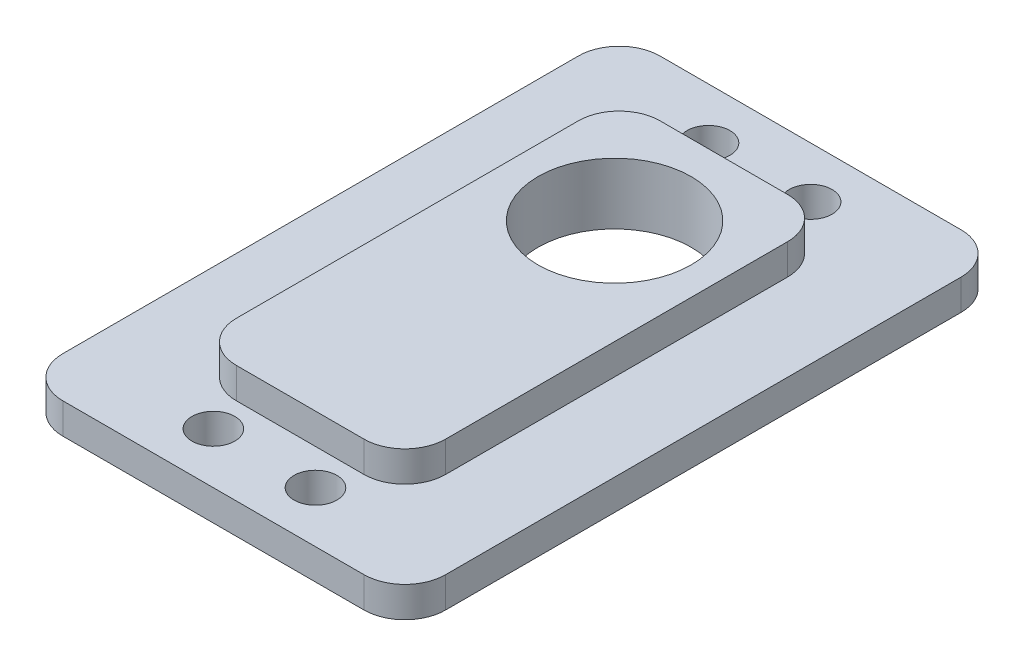
ISO-10303-21;
HEADER;
FILE_DESCRIPTION(('STEP AP214'),'2;1');
FILE_NAME('part.step','',(''),(''),'','','');
FILE_SCHEMA(('AUTOMOTIVE_DESIGN { 1 0 10303 214 1 1 1 1 }'));
ENDSEC;
DATA;
#1=APPLICATION_CONTEXT('core data for automotive mechanical design processes');
#2=APPLICATION_PROTOCOL_DEFINITION('international standard','automotive_design',2000,#1);
#3=PRODUCT_CONTEXT('',#1,'mechanical');
#4=PRODUCT('Part','Part','',(#3));
#5=PRODUCT_RELATED_PRODUCT_CATEGORY('part','',(#4));
#6=PRODUCT_DEFINITION_FORMATION('','',#4);
#7=PRODUCT_DEFINITION_CONTEXT('part definition',#1,'design');
#8=PRODUCT_DEFINITION('design','',#6,#7);
#9=PRODUCT_DEFINITION_SHAPE('','',#8);
#10=(LENGTH_UNIT() NAMED_UNIT(*) SI_UNIT(.MILLI.,.METRE.));
#11=(NAMED_UNIT(*) PLANE_ANGLE_UNIT() SI_UNIT($,.RADIAN.));
#12=(NAMED_UNIT(*) SI_UNIT($,.STERADIAN.) SOLID_ANGLE_UNIT());
#13=UNCERTAINTY_MEASURE_WITH_UNIT(LENGTH_MEASURE(1.E-05),#10,'distance_accuracy_value','');
#14=(GEOMETRIC_REPRESENTATION_CONTEXT(3) GLOBAL_UNCERTAINTY_ASSIGNED_CONTEXT((#13)) GLOBAL_UNIT_ASSIGNED_CONTEXT((#10,
#11,#12)) REPRESENTATION_CONTEXT('',''));
#15=CARTESIAN_POINT('',(0.,0.,0.));
#16=DIRECTION('',(0.,0.,1.));
#17=DIRECTION('',(1.,0.,0.));
#18=AXIS2_PLACEMENT_3D('',#15,#16,#17);
#19=CARTESIAN_POINT('',(0.,6.,0.));
#20=DIRECTION('',(0.,1.,0.));
#21=DIRECTION('',(0.,0.,1.));
#22=AXIS2_PLACEMENT_3D('',#19,#20,#21);
#23=PLANE('',#22);
#24=DIRECTION('',(1.,0.,0.));
#25=VECTOR('',#24,1.);
#26=CARTESIAN_POINT('',(-10.25,6.,-10.7));
#27=LINE('',#26,#25);
#28=CARTESIAN_POINT('',(-6.25,6.,-10.7));
#29=VERTEX_POINT('',#28);
#30=CARTESIAN_POINT('',(6.25,6.,-10.7));
#31=VERTEX_POINT('',#30);
#32=EDGE_CURVE('E283',#29,#31,#27,.T.);
#33=ORIENTED_EDGE('',*,*,#32,.F.);
#34=CARTESIAN_POINT('',(-6.25,6.,-6.7));
#35=DIRECTION('',(0.,1.,0.));
#36=DIRECTION('',(0.,0.,1.));
#37=AXIS2_PLACEMENT_3D('',#34,#35,#36);
#38=CIRCLE('',#37,4.);
#39=CARTESIAN_POINT('',(-10.25,6.,-6.7));
#40=VERTEX_POINT('',#39);
#41=EDGE_CURVE('E303',#29,#40,#38,.T.);
#42=ORIENTED_EDGE('',*,*,#41,.T.);
#43=DIRECTION('',(0.,0.,1.));
#44=VECTOR('',#43,1.);
#45=CARTESIAN_POINT('',(-10.25,6.,-10.7));
#46=LINE('',#45,#44);
#47=CARTESIAN_POINT('',(-10.25,6.,26.8));
#48=VERTEX_POINT('',#47);
#49=EDGE_CURVE('E192',#40,#48,#46,.T.);
#50=ORIENTED_EDGE('',*,*,#49,.T.);
#51=CARTESIAN_POINT('',(-6.25,6.,26.8));
#52=DIRECTION('',(0.,1.,0.));
#53=DIRECTION('',(0.,0.,1.));
#54=AXIS2_PLACEMENT_3D('',#51,#52,#53);
#55=CIRCLE('',#54,4.);
#56=CARTESIAN_POINT('',(-6.25,6.,30.8));
#57=VERTEX_POINT('',#56);
#58=EDGE_CURVE('E294',#48,#57,#55,.T.);
#59=ORIENTED_EDGE('',*,*,#58,.T.);
#60=DIRECTION('',(1.,0.,0.));
#61=VECTOR('',#60,1.);
#62=CARTESIAN_POINT('',(-10.25,6.,30.8));
#63=LINE('',#62,#61);
#64=CARTESIAN_POINT('',(6.25,6.,30.8));
#65=VERTEX_POINT('',#64);
#66=EDGE_CURVE('E275',#57,#65,#63,.T.);
#67=ORIENTED_EDGE('',*,*,#66,.T.);
#68=CARTESIAN_POINT('',(6.25,6.,26.8));
#69=DIRECTION('',(0.,1.,0.));
#70=DIRECTION('',(0.,0.,1.));
#71=AXIS2_PLACEMENT_3D('',#68,#69,#70);
#72=CIRCLE('',#71,4.);
#73=CARTESIAN_POINT('',(10.25,6.,26.8));
#74=VERTEX_POINT('',#73);
#75=EDGE_CURVE('E297',#65,#74,#72,.T.);
#76=ORIENTED_EDGE('',*,*,#75,.T.);
#77=DIRECTION('',(0.,0.,1.));
#78=VECTOR('',#77,1.);
#79=CARTESIAN_POINT('',(10.25,6.,-10.7));
#80=LINE('',#79,#78);
#81=CARTESIAN_POINT('',(10.25,6.,-6.7));
#82=VERTEX_POINT('',#81);
#83=EDGE_CURVE('E279',#82,#74,#80,.T.);
#84=ORIENTED_EDGE('',*,*,#83,.F.);
#85=CARTESIAN_POINT('',(6.25,6.,-6.7));
#86=DIRECTION('',(0.,1.,0.));
#87=DIRECTION('',(0.,0.,1.));
#88=AXIS2_PLACEMENT_3D('',#85,#86,#87);
#89=CIRCLE('',#88,4.);
#90=EDGE_CURVE('E300',#82,#31,#89,.T.);
#91=ORIENTED_EDGE('',*,*,#90,.T.);
#92=EDGE_LOOP('',(#33,#42,#50,#59,#67,#76,#84,#91));
#93=FACE_BOUND('',#92,.T.);
#94=CARTESIAN_POINT('',(0.,6.,0.));
#95=DIRECTION('',(0.,1.,0.));
#96=DIRECTION('',(0.,0.,1.));
#97=AXIS2_PLACEMENT_3D('',#94,#95,#96);
#98=CIRCLE('',#97,7.5);
#99=CARTESIAN_POINT('',(0.,6.,7.5));
#100=VERTEX_POINT('',#99);
#101=EDGE_CURVE('E266',#100,#100,#98,.T.);
#102=ORIENTED_EDGE('',*,*,#101,.F.);
#103=EDGE_LOOP('',(#102));
#104=FACE_BOUND('',#103,.T.);
#105=ADVANCED_FACE('F56',(#93,#104),#23,.T.);
#106=CARTESIAN_POINT('',(0.,0.,0.));
#107=DIRECTION('',(0.,1.,0.));
#108=DIRECTION('',(0.,0.,1.));
#109=AXIS2_PLACEMENT_3D('',#106,#107,#108);
#110=PLANE('',#109);
#111=CARTESIAN_POINT('',(0.,0.,0.));
#112=DIRECTION('',(0.,1.,0.));
#113=DIRECTION('',(0.,0.,1.));
#114=AXIS2_PLACEMENT_3D('',#111,#112,#113);
#115=CIRCLE('',#114,7.5);
#116=CARTESIAN_POINT('',(0.,0.,7.5));
#117=VERTEX_POINT('',#116);
#118=EDGE_CURVE('E233',#117,#117,#115,.T.);
#119=ORIENTED_EDGE('',*,*,#118,.T.);
#120=EDGE_LOOP('',(#119));
#121=FACE_BOUND('',#120,.T.);
#122=CARTESIAN_POINT('',(4.99999999999999,0.,34.3));
#123=DIRECTION('',(0.,1.,0.));
#124=DIRECTION('',(0.,0.,1.));
#125=AXIS2_PLACEMENT_3D('',#122,#123,#124);
#126=CIRCLE('',#125,2.1);
#127=CARTESIAN_POINT('',(4.99999999999999,0.,36.4));
#128=VERTEX_POINT('',#127);
#129=EDGE_CURVE('E234',#128,#128,#126,.T.);
#130=ORIENTED_EDGE('',*,*,#129,.T.);
#131=EDGE_LOOP('',(#130));
#132=FACE_BOUND('',#131,.T.);
#133=CARTESIAN_POINT('',(-5.,0.,34.3));
#134=DIRECTION('',(0.,1.,0.));
#135=DIRECTION('',(0.,0.,1.));
#136=AXIS2_PLACEMENT_3D('',#133,#134,#135);
#137=CIRCLE('',#136,2.1);
#138=CARTESIAN_POINT('',(-5.,0.,36.4));
#139=VERTEX_POINT('',#138);
#140=EDGE_CURVE('E238',#139,#139,#137,.T.);
#141=ORIENTED_EDGE('',*,*,#140,.T.);
#142=EDGE_LOOP('',(#141));
#143=FACE_BOUND('',#142,.T.);
#144=CARTESIAN_POINT('',(-5.00000000000001,0.,-14.2));
#145=DIRECTION('',(0.,1.,0.));
#146=DIRECTION('',(0.,0.,1.));
#147=AXIS2_PLACEMENT_3D('',#144,#145,#146);
#148=CIRCLE('',#147,2.10000000000001);
#149=CARTESIAN_POINT('',(-5.00000000000001,0.,-12.1));
#150=VERTEX_POINT('',#149);
#151=EDGE_CURVE('E242',#150,#150,#148,.T.);
#152=ORIENTED_EDGE('',*,*,#151,.T.);
#153=EDGE_LOOP('',(#152));
#154=FACE_BOUND('',#153,.T.);
#155=CARTESIAN_POINT('',(4.99999999999999,0.,-14.2));
#156=DIRECTION('',(0.,1.,0.));
#157=DIRECTION('',(0.,0.,1.));
#158=AXIS2_PLACEMENT_3D('',#155,#156,#157);
#159=CIRCLE('',#158,2.1);
#160=CARTESIAN_POINT('',(4.99999999999999,0.,-12.1));
#161=VERTEX_POINT('',#160);
#162=EDGE_CURVE('E246',#161,#161,#159,.T.);
#163=ORIENTED_EDGE('',*,*,#162,.T.);
#164=EDGE_LOOP('',(#163));
#165=FACE_BOUND('',#164,.T.);
#166=DIRECTION('',(0.,0.,1.));
#167=VECTOR('',#166,1.);
#168=CARTESIAN_POINT('',(-18.75,0.,0.));
#169=LINE('',#168,#167);
#170=CARTESIAN_POINT('',(-18.75,0.,-15.2));
#171=VERTEX_POINT('',#170);
#172=CARTESIAN_POINT('',(-18.75,0.,35.3));
#173=VERTEX_POINT('',#172);
#174=EDGE_CURVE('E258',#171,#173,#169,.T.);
#175=ORIENTED_EDGE('',*,*,#174,.F.);
#176=CARTESIAN_POINT('',(-14.75,0.,-15.2));
#177=DIRECTION('',(0.,1.,0.));
#178=DIRECTION('',(0.,0.,1.));
#179=AXIS2_PLACEMENT_3D('',#176,#177,#178);
#180=CIRCLE('',#179,4.);
#181=CARTESIAN_POINT('',(-14.75,0.,-19.2));
#182=VERTEX_POINT('',#181);
#183=EDGE_CURVE('E322',#171,#182,#180,.F.);
#184=ORIENTED_EDGE('',*,*,#183,.T.);
#185=DIRECTION('',(1.,0.,0.));
#186=VECTOR('',#185,1.);
#187=CARTESIAN_POINT('',(0.,0.,-19.2));
#188=LINE('',#187,#186);
#189=CARTESIAN_POINT('',(14.75,0.,-19.2));
#190=VERTEX_POINT('',#189);
#191=EDGE_CURVE('E254',#182,#190,#188,.T.);
#192=ORIENTED_EDGE('',*,*,#191,.T.);
#193=CARTESIAN_POINT('',(14.75,0.,-15.2));
#194=DIRECTION('',(0.,1.,0.));
#195=DIRECTION('',(0.,0.,1.));
#196=AXIS2_PLACEMENT_3D('',#193,#194,#195);
#197=CIRCLE('',#196,4.);
#198=CARTESIAN_POINT('',(18.75,0.,-15.2));
#199=VERTEX_POINT('',#198);
#200=EDGE_CURVE('E319',#190,#199,#197,.F.);
#201=ORIENTED_EDGE('',*,*,#200,.T.);
#202=DIRECTION('',(0.,0.,1.));
#203=VECTOR('',#202,1.);
#204=CARTESIAN_POINT('',(18.75,0.,0.));
#205=LINE('',#204,#203);
#206=CARTESIAN_POINT('',(18.75,0.,35.3));
#207=VERTEX_POINT('',#206);
#208=EDGE_CURVE('E250',#199,#207,#205,.T.);
#209=ORIENTED_EDGE('',*,*,#208,.T.);
#210=CARTESIAN_POINT('',(14.75,0.,35.3));
#211=DIRECTION('',(0.,1.,0.));
#212=DIRECTION('',(0.,0.,1.));
#213=AXIS2_PLACEMENT_3D('',#210,#211,#212);
#214=CIRCLE('',#213,4.);
#215=CARTESIAN_POINT('',(14.75,0.,39.3));
#216=VERTEX_POINT('',#215);
#217=EDGE_CURVE('E316',#207,#216,#214,.F.);
#218=ORIENTED_EDGE('',*,*,#217,.T.);
#219=DIRECTION('',(1.,0.,0.));
#220=VECTOR('',#219,1.);
#221=CARTESIAN_POINT('',(0.,0.,39.3));
#222=LINE('',#221,#220);
#223=CARTESIAN_POINT('',(-14.75,0.,39.3));
#224=VERTEX_POINT('',#223);
#225=EDGE_CURVE('E262',#224,#216,#222,.T.);
#226=ORIENTED_EDGE('',*,*,#225,.F.);
#227=CARTESIAN_POINT('',(-14.75,0.,35.3));
#228=DIRECTION('',(0.,1.,0.));
#229=DIRECTION('',(0.,0.,1.));
#230=AXIS2_PLACEMENT_3D('',#227,#228,#229);
#231=CIRCLE('',#230,4.);
#232=EDGE_CURVE('E313',#224,#173,#231,.F.);
#233=ORIENTED_EDGE('',*,*,#232,.T.);
#234=EDGE_LOOP('',(#175,#184,#192,#201,#209,#218,#226,#233));
#235=FACE_BOUND('',#234,.T.);
#236=ADVANCED_FACE('F407',(#121,#132,#143,#154,#165,#235),#110,.F.);
#237=CARTESIAN_POINT('',(-10.25,6.,-10.7));
#238=DIRECTION('',(1.,0.,0.));
#239=DIRECTION('',(0.,0.,-1.));
#240=AXIS2_PLACEMENT_3D('',#237,#238,#239);
#241=PLANE('',#240);
#242=ORIENTED_EDGE('',*,*,#49,.F.);
#243=DIRECTION('',(0.,-1.,0.));
#244=VECTOR('',#243,1.);
#245=CARTESIAN_POINT('',(-10.25,3.,-6.7));
#246=LINE('',#245,#244);
#247=CARTESIAN_POINT('',(-10.25,3.,-6.7));
#248=VERTEX_POINT('',#247);
#249=EDGE_CURVE('E175',#40,#248,#246,.T.);
#250=ORIENTED_EDGE('',*,*,#249,.T.);
#251=DIRECTION('',(0.,0.,1.));
#252=VECTOR('',#251,1.);
#253=CARTESIAN_POINT('',(-10.25,3.,0.));
#254=LINE('',#253,#252);
#255=CARTESIAN_POINT('',(-10.25,3.,26.8));
#256=VERTEX_POINT('',#255);
#257=EDGE_CURVE('E189',#248,#256,#254,.T.);
#258=ORIENTED_EDGE('',*,*,#257,.T.);
#259=DIRECTION('',(0.,-1.,0.));
#260=VECTOR('',#259,1.);
#261=CARTESIAN_POINT('',(-10.25,6.,26.8));
#262=LINE('',#261,#260);
#263=EDGE_CURVE('E195',#256,#48,#262,.F.);
#264=ORIENTED_EDGE('',*,*,#263,.T.);
#265=EDGE_LOOP('',(#242,#250,#258,#264));
#266=FACE_BOUND('',#265,.T.);
#267=ADVANCED_FACE('F188',(#266),#241,.F.);
#268=CARTESIAN_POINT('',(-10.25,6.,30.8));
#269=DIRECTION('',(0.,0.,-1.));
#270=DIRECTION('',(-1.,0.,0.));
#271=AXIS2_PLACEMENT_3D('',#268,#269,#270);
#272=PLANE('',#271);
#273=DIRECTION('',(1.,0.,0.));
#274=VECTOR('',#273,1.);
#275=CARTESIAN_POINT('',(0.,3.,30.8));
#276=LINE('',#275,#274);
#277=CARTESIAN_POINT('',(-6.25,3.,30.8));
#278=VERTEX_POINT('',#277);
#279=CARTESIAN_POINT('',(6.25,3.,30.8));
#280=VERTEX_POINT('',#279);
#281=EDGE_CURVE('E215',#278,#280,#276,.T.);
#282=ORIENTED_EDGE('',*,*,#281,.T.);
#283=DIRECTION('',(0.,-1.,0.));
#284=VECTOR('',#283,1.);
#285=CARTESIAN_POINT('',(6.25,6.,30.8));
#286=LINE('',#285,#284);
#287=EDGE_CURVE('E183',#280,#65,#286,.F.);
#288=ORIENTED_EDGE('',*,*,#287,.T.);
#289=ORIENTED_EDGE('',*,*,#66,.F.);
#290=DIRECTION('',(0.,-1.,0.));
#291=VECTOR('',#290,1.);
#292=CARTESIAN_POINT('',(-6.25,6.,30.8));
#293=LINE('',#292,#291);
#294=EDGE_CURVE('E363',#57,#278,#293,.T.);
#295=ORIENTED_EDGE('',*,*,#294,.T.);
#296=EDGE_LOOP('',(#282,#288,#289,#295));
#297=FACE_BOUND('',#296,.T.);
#298=ADVANCED_FACE('F376',(#297),#272,.F.);
#299=CARTESIAN_POINT('',(10.25,6.,-10.7));
#300=DIRECTION('',(1.,0.,0.));
#301=DIRECTION('',(0.,0.,-1.));
#302=AXIS2_PLACEMENT_3D('',#299,#300,#301);
#303=PLANE('',#302);
#304=DIRECTION('',(0.,0.,1.));
#305=VECTOR('',#304,1.);
#306=CARTESIAN_POINT('',(10.25,3.,0.));
#307=LINE('',#306,#305);
#308=CARTESIAN_POINT('',(10.25,3.,-6.7));
#309=VERTEX_POINT('',#308);
#310=CARTESIAN_POINT('',(10.25,3.,26.8));
#311=VERTEX_POINT('',#310);
#312=EDGE_CURVE('E205',#309,#311,#307,.T.);
#313=ORIENTED_EDGE('',*,*,#312,.F.);
#314=DIRECTION('',(0.,-1.,0.));
#315=VECTOR('',#314,1.);
#316=CARTESIAN_POINT('',(10.25,6.,-6.7));
#317=LINE('',#316,#315);
#318=EDGE_CURVE('E360',#309,#82,#317,.F.);
#319=ORIENTED_EDGE('',*,*,#318,.T.);
#320=ORIENTED_EDGE('',*,*,#83,.T.);
#321=DIRECTION('',(0.,-1.,0.));
#322=VECTOR('',#321,1.);
#323=CARTESIAN_POINT('',(10.25,3.,26.8));
#324=LINE('',#323,#322);
#325=EDGE_CURVE('E356',#74,#311,#324,.T.);
#326=ORIENTED_EDGE('',*,*,#325,.T.);
#327=EDGE_LOOP('',(#313,#319,#320,#326));
#328=FACE_BOUND('',#327,.T.);
#329=ADVANCED_FACE('F387',(#328),#303,.T.);
#330=CARTESIAN_POINT('',(-10.25,6.,-10.7));
#331=DIRECTION('',(0.,0.,-1.));
#332=DIRECTION('',(-1.,0.,0.));
#333=AXIS2_PLACEMENT_3D('',#330,#331,#332);
#334=PLANE('',#333);
#335=DIRECTION('',(1.,0.,0.));
#336=VECTOR('',#335,1.);
#337=CARTESIAN_POINT('',(0.,3.,-10.7));
#338=LINE('',#337,#336);
#339=CARTESIAN_POINT('',(-6.25,3.,-10.7));
#340=VERTEX_POINT('',#339);
#341=CARTESIAN_POINT('',(6.25,3.,-10.7));
#342=VERTEX_POINT('',#341);
#343=EDGE_CURVE('E200',#340,#342,#338,.T.);
#344=ORIENTED_EDGE('',*,*,#343,.F.);
#345=DIRECTION('',(0.,-1.,0.));
#346=VECTOR('',#345,1.);
#347=CARTESIAN_POINT('',(-6.25,6.,-10.7));
#348=LINE('',#347,#346);
#349=EDGE_CURVE('E176',#340,#29,#348,.F.);
#350=ORIENTED_EDGE('',*,*,#349,.T.);
#351=ORIENTED_EDGE('',*,*,#32,.T.);
#352=DIRECTION('',(0.,-1.,0.));
#353=VECTOR('',#352,1.);
#354=CARTESIAN_POINT('',(6.25,6.,-10.7));
#355=LINE('',#354,#353);
#356=EDGE_CURVE('E194',#31,#342,#355,.T.);
#357=ORIENTED_EDGE('',*,*,#356,.T.);
#358=EDGE_LOOP('',(#344,#350,#351,#357));
#359=FACE_BOUND('',#358,.T.);
#360=ADVANCED_FACE('F393',(#359),#334,.T.);
#361=CARTESIAN_POINT('',(0.,6.,0.));
#362=DIRECTION('',(0.,-1.,0.));
#363=DIRECTION('',(0.,0.,-1.));
#364=AXIS2_PLACEMENT_3D('',#361,#362,#363);
#365=CYLINDRICAL_SURFACE('',#364,7.5);
#366=ORIENTED_EDGE('',*,*,#101,.T.);
#367=EDGE_LOOP('',(#366));
#368=FACE_BOUND('',#367,.T.);
#369=ORIENTED_EDGE('',*,*,#118,.F.);
#370=EDGE_LOOP('',(#369));
#371=FACE_BOUND('',#370,.T.);
#372=ADVANCED_FACE('F395',(#368,#371),#365,.F.);
#373=CARTESIAN_POINT('',(18.75,3.,0.));
#374=DIRECTION('',(1.,0.,0.));
#375=DIRECTION('',(0.,0.,-1.));
#376=AXIS2_PLACEMENT_3D('',#373,#374,#375);
#377=PLANE('',#376);
#378=ORIENTED_EDGE('',*,*,#208,.F.);
#379=DIRECTION('',(0.,-1.,0.));
#380=VECTOR('',#379,1.);
#381=CARTESIAN_POINT('',(18.75,3.,-15.2));
#382=LINE('',#381,#380);
#383=CARTESIAN_POINT('',(18.75,3.,-15.2));
#384=VERTEX_POINT('',#383);
#385=EDGE_CURVE('E347',#199,#384,#382,.F.);
#386=ORIENTED_EDGE('',*,*,#385,.T.);
#387=DIRECTION('',(0.,0.,1.));
#388=VECTOR('',#387,1.);
#389=CARTESIAN_POINT('',(18.75,3.,0.));
#390=LINE('',#389,#388);
#391=CARTESIAN_POINT('',(18.75,3.,35.3));
#392=VERTEX_POINT('',#391);
#393=EDGE_CURVE('E219',#384,#392,#390,.T.);
#394=ORIENTED_EDGE('',*,*,#393,.T.);
#395=DIRECTION('',(0.,-1.,0.));
#396=VECTOR('',#395,1.);
#397=CARTESIAN_POINT('',(18.75,0.,35.3));
#398=LINE('',#397,#396);
#399=EDGE_CURVE('E343',#392,#207,#398,.T.);
#400=ORIENTED_EDGE('',*,*,#399,.T.);
#401=EDGE_LOOP('',(#378,#386,#394,#400));
#402=FACE_BOUND('',#401,.T.);
#403=ADVANCED_FACE('F401',(#402),#377,.T.);
#404=CARTESIAN_POINT('',(0.,3.,-19.2));
#405=DIRECTION('',(0.,0.,-1.));
#406=DIRECTION('',(-1.,0.,0.));
#407=AXIS2_PLACEMENT_3D('',#404,#405,#406);
#408=PLANE('',#407);
#409=ORIENTED_EDGE('',*,*,#191,.F.);
#410=DIRECTION('',(0.,-1.,0.));
#411=VECTOR('',#410,1.);
#412=CARTESIAN_POINT('',(-14.75,3.,-19.2));
#413=LINE('',#412,#411);
#414=CARTESIAN_POINT('',(-14.75,3.,-19.2));
#415=VERTEX_POINT('',#414);
#416=EDGE_CURVE('E329',#182,#415,#413,.F.);
#417=ORIENTED_EDGE('',*,*,#416,.T.);
#418=DIRECTION('',(1.,0.,0.));
#419=VECTOR('',#418,1.);
#420=CARTESIAN_POINT('',(0.,3.,-19.2));
#421=LINE('',#420,#419);
#422=CARTESIAN_POINT('',(14.75,3.,-19.2));
#423=VERTEX_POINT('',#422);
#424=EDGE_CURVE('E223',#415,#423,#421,.T.);
#425=ORIENTED_EDGE('',*,*,#424,.T.);
#426=DIRECTION('',(0.,-1.,0.));
#427=VECTOR('',#426,1.);
#428=CARTESIAN_POINT('',(14.75,3.,-19.2));
#429=LINE('',#428,#427);
#430=EDGE_CURVE('E325',#423,#190,#429,.T.);
#431=ORIENTED_EDGE('',*,*,#430,.T.);
#432=EDGE_LOOP('',(#409,#417,#425,#431));
#433=FACE_BOUND('',#432,.T.);
#434=ADVANCED_FACE('F434',(#433),#408,.T.);
#435=CARTESIAN_POINT('',(-18.75,3.,0.));
#436=DIRECTION('',(1.,0.,0.));
#437=DIRECTION('',(0.,0.,-1.));
#438=AXIS2_PLACEMENT_3D('',#435,#436,#437);
#439=PLANE('',#438);
#440=DIRECTION('',(0.,0.,1.));
#441=VECTOR('',#440,1.);
#442=CARTESIAN_POINT('',(-18.75,3.,0.));
#443=LINE('',#442,#441);
#444=CARTESIAN_POINT('',(-18.75,3.,-15.2));
#445=VERTEX_POINT('',#444);
#446=CARTESIAN_POINT('',(-18.75,3.,35.3));
#447=VERTEX_POINT('',#446);
#448=EDGE_CURVE('E227',#445,#447,#443,.T.);
#449=ORIENTED_EDGE('',*,*,#448,.F.);
#450=DIRECTION('',(0.,-1.,0.));
#451=VECTOR('',#450,1.);
#452=CARTESIAN_POINT('',(-18.75,0.,-15.2));
#453=LINE('',#452,#451);
#454=EDGE_CURVE('E309',#445,#171,#453,.T.);
#455=ORIENTED_EDGE('',*,*,#454,.T.);
#456=ORIENTED_EDGE('',*,*,#174,.T.);
#457=DIRECTION('',(0.,-1.,0.));
#458=VECTOR('',#457,1.);
#459=CARTESIAN_POINT('',(-18.75,3.,35.3));
#460=LINE('',#459,#458);
#461=EDGE_CURVE('E306',#173,#447,#460,.F.);
#462=ORIENTED_EDGE('',*,*,#461,.T.);
#463=EDGE_LOOP('',(#449,#455,#456,#462));
#464=FACE_BOUND('',#463,.T.);
#465=ADVANCED_FACE('F430',(#464),#439,.F.);
#466=CARTESIAN_POINT('',(4.99999999999999,3.,-14.2));
#467=DIRECTION('',(0.,-1.,0.));
#468=DIRECTION('',(0.,0.,-1.));
#469=AXIS2_PLACEMENT_3D('',#466,#467,#468);
#470=CYLINDRICAL_SURFACE('',#469,2.1);
#471=CARTESIAN_POINT('',(4.99999999999999,3.,-14.2));
#472=DIRECTION('',(0.,1.,0.));
#473=DIRECTION('',(0.,0.,1.));
#474=AXIS2_PLACEMENT_3D('',#471,#472,#473);
#475=CIRCLE('',#474,2.1);
#476=CARTESIAN_POINT('',(4.99999999999999,3.,-12.1));
#477=VERTEX_POINT('',#476);
#478=EDGE_CURVE('E201',#477,#477,#475,.T.);
#479=ORIENTED_EDGE('',*,*,#478,.T.);
#480=EDGE_LOOP('',(#479));
#481=FACE_BOUND('',#480,.T.);
#482=ORIENTED_EDGE('',*,*,#162,.F.);
#483=EDGE_LOOP('',(#482));
#484=FACE_BOUND('',#483,.T.);
#485=ADVANCED_FACE('F426',(#481,#484),#470,.F.);
#486=CARTESIAN_POINT('',(-5.00000000000001,3.,-14.2));
#487=DIRECTION('',(0.,-1.,0.));
#488=DIRECTION('',(0.,0.,-1.));
#489=AXIS2_PLACEMENT_3D('',#486,#487,#488);
#490=CYLINDRICAL_SURFACE('',#489,2.10000000000001);
#491=CARTESIAN_POINT('',(-5.00000000000001,3.,-14.2));
#492=DIRECTION('',(0.,1.,0.));
#493=DIRECTION('',(0.,0.,1.));
#494=AXIS2_PLACEMENT_3D('',#491,#492,#493);
#495=CIRCLE('',#494,2.10000000000001);
#496=CARTESIAN_POINT('',(-5.00000000000001,3.,-12.1));
#497=VERTEX_POINT('',#496);
#498=EDGE_CURVE('E208',#497,#497,#495,.T.);
#499=ORIENTED_EDGE('',*,*,#498,.T.);
#500=EDGE_LOOP('',(#499));
#501=FACE_BOUND('',#500,.T.);
#502=ORIENTED_EDGE('',*,*,#151,.F.);
#503=EDGE_LOOP('',(#502));
#504=FACE_BOUND('',#503,.T.);
#505=ADVANCED_FACE('F422',(#501,#504),#490,.F.);
#506=CARTESIAN_POINT('',(-5.,3.,34.3));
#507=DIRECTION('',(0.,-1.,0.));
#508=DIRECTION('',(0.,0.,-1.));
#509=AXIS2_PLACEMENT_3D('',#506,#507,#508);
#510=CYLINDRICAL_SURFACE('',#509,2.1);
#511=CARTESIAN_POINT('',(-5.,3.,34.3));
#512=DIRECTION('',(0.,1.,0.));
#513=DIRECTION('',(0.,0.,1.));
#514=AXIS2_PLACEMENT_3D('',#511,#512,#513);
#515=CIRCLE('',#514,2.1);
#516=CARTESIAN_POINT('',(-5.,3.,36.4));
#517=VERTEX_POINT('',#516);
#518=EDGE_CURVE('E457',#517,#517,#515,.T.);
#519=ORIENTED_EDGE('',*,*,#518,.T.);
#520=EDGE_LOOP('',(#519));
#521=FACE_BOUND('',#520,.T.);
#522=ORIENTED_EDGE('',*,*,#140,.F.);
#523=EDGE_LOOP('',(#522));
#524=FACE_BOUND('',#523,.T.);
#525=ADVANCED_FACE('F418',(#521,#524),#510,.F.);
#526=CARTESIAN_POINT('',(4.99999999999999,3.,34.3));
#527=DIRECTION('',(0.,-1.,0.));
#528=DIRECTION('',(0.,0.,-1.));
#529=AXIS2_PLACEMENT_3D('',#526,#527,#528);
#530=CYLINDRICAL_SURFACE('',#529,2.1);
#531=CARTESIAN_POINT('',(4.99999999999999,3.,34.3));
#532=DIRECTION('',(0.,1.,0.));
#533=DIRECTION('',(0.,0.,1.));
#534=AXIS2_PLACEMENT_3D('',#531,#532,#533);
#535=CIRCLE('',#534,2.1);
#536=CARTESIAN_POINT('',(4.99999999999999,3.,36.4));
#537=VERTEX_POINT('',#536);
#538=EDGE_CURVE('E265',#537,#537,#535,.T.);
#539=ORIENTED_EDGE('',*,*,#538,.T.);
#540=EDGE_LOOP('',(#539));
#541=FACE_BOUND('',#540,.T.);
#542=ORIENTED_EDGE('',*,*,#129,.F.);
#543=EDGE_LOOP('',(#542));
#544=FACE_BOUND('',#543,.T.);
#545=ADVANCED_FACE('F414',(#541,#544),#530,.F.);
#546=CARTESIAN_POINT('',(0.,3.,39.3));
#547=DIRECTION('',(0.,0.,-1.));
#548=DIRECTION('',(-1.,0.,0.));
#549=AXIS2_PLACEMENT_3D('',#546,#547,#548);
#550=PLANE('',#549);
#551=ORIENTED_EDGE('',*,*,#225,.T.);
#552=DIRECTION('',(0.,-1.,0.));
#553=VECTOR('',#552,1.);
#554=CARTESIAN_POINT('',(14.75,3.,39.3));
#555=LINE('',#554,#553);
#556=CARTESIAN_POINT('',(14.75,3.,39.3));
#557=VERTEX_POINT('',#556);
#558=EDGE_CURVE('E72',#216,#557,#555,.F.);
#559=ORIENTED_EDGE('',*,*,#558,.T.);
#560=DIRECTION('',(1.,0.,0.));
#561=VECTOR('',#560,1.);
#562=CARTESIAN_POINT('',(0.,3.,39.3));
#563=LINE('',#562,#561);
#564=CARTESIAN_POINT('',(-14.75,3.,39.3));
#565=VERTEX_POINT('',#564);
#566=EDGE_CURVE('E230',#565,#557,#563,.T.);
#567=ORIENTED_EDGE('',*,*,#566,.F.);
#568=DIRECTION('',(0.,-1.,0.));
#569=VECTOR('',#568,1.);
#570=CARTESIAN_POINT('',(-14.75,3.,39.3));
#571=LINE('',#570,#569);
#572=EDGE_CURVE('E350',#565,#224,#571,.T.);
#573=ORIENTED_EDGE('',*,*,#572,.T.);
#574=EDGE_LOOP('',(#551,#559,#567,#573));
#575=FACE_BOUND('',#574,.T.);
#576=ADVANCED_FACE('F417',(#575),#550,.F.);
#577=CARTESIAN_POINT('',(0.,3.,0.));
#578=DIRECTION('',(0.,1.,0.));
#579=DIRECTION('',(0.,0.,1.));
#580=AXIS2_PLACEMENT_3D('',#577,#578,#579);
#581=PLANE('',#580);
#582=ORIENTED_EDGE('',*,*,#538,.F.);
#583=EDGE_LOOP('',(#582));
#584=FACE_BOUND('',#583,.T.);
#585=ORIENTED_EDGE('',*,*,#518,.F.);
#586=EDGE_LOOP('',(#585));
#587=FACE_BOUND('',#586,.T.);
#588=ORIENTED_EDGE('',*,*,#498,.F.);
#589=EDGE_LOOP('',(#588));
#590=FACE_BOUND('',#589,.T.);
#591=ORIENTED_EDGE('',*,*,#478,.F.);
#592=EDGE_LOOP('',(#591));
#593=FACE_BOUND('',#592,.T.);
#594=ORIENTED_EDGE('',*,*,#257,.F.);
#595=CARTESIAN_POINT('',(-6.25,3.,-6.7));
#596=DIRECTION('',(0.,1.,0.));
#597=DIRECTION('',(0.,0.,1.));
#598=AXIS2_PLACEMENT_3D('',#595,#596,#597);
#599=CIRCLE('',#598,4.);
#600=EDGE_CURVE('E171',#248,#340,#599,.F.);
#601=ORIENTED_EDGE('',*,*,#600,.T.);
#602=ORIENTED_EDGE('',*,*,#343,.T.);
#603=CARTESIAN_POINT('',(6.25,3.,-6.7));
#604=DIRECTION('',(0.,1.,0.));
#605=DIRECTION('',(0.,0.,1.));
#606=AXIS2_PLACEMENT_3D('',#603,#604,#605);
#607=CIRCLE('',#606,4.);
#608=EDGE_CURVE('E182',#342,#309,#607,.F.);
#609=ORIENTED_EDGE('',*,*,#608,.T.);
#610=ORIENTED_EDGE('',*,*,#312,.T.);
#611=CARTESIAN_POINT('',(6.25,3.,26.8));
#612=DIRECTION('',(0.,1.,0.));
#613=DIRECTION('',(0.,0.,1.));
#614=AXIS2_PLACEMENT_3D('',#611,#612,#613);
#615=CIRCLE('',#614,4.);
#616=EDGE_CURVE('E65',#311,#280,#615,.F.);
#617=ORIENTED_EDGE('',*,*,#616,.T.);
#618=ORIENTED_EDGE('',*,*,#281,.F.);
#619=CARTESIAN_POINT('',(-6.25,3.,26.8));
#620=DIRECTION('',(0.,1.,0.));
#621=DIRECTION('',(0.,0.,1.));
#622=AXIS2_PLACEMENT_3D('',#619,#620,#621);
#623=CIRCLE('',#622,4.);
#624=EDGE_CURVE('E12',#278,#256,#623,.F.);
#625=ORIENTED_EDGE('',*,*,#624,.T.);
#626=EDGE_LOOP('',(#594,#601,#602,#609,#610,#617,#618,#625));
#627=FACE_BOUND('',#626,.T.);
#628=ORIENTED_EDGE('',*,*,#424,.F.);
#629=CARTESIAN_POINT('',(-14.75,3.,-15.2));
#630=DIRECTION('',(0.,1.,0.));
#631=DIRECTION('',(0.,0.,1.));
#632=AXIS2_PLACEMENT_3D('',#629,#630,#631);
#633=CIRCLE('',#632,4.);
#634=EDGE_CURVE('E340',#415,#445,#633,.T.);
#635=ORIENTED_EDGE('',*,*,#634,.T.);
#636=ORIENTED_EDGE('',*,*,#448,.T.);
#637=CARTESIAN_POINT('',(-14.75,3.,35.3));
#638=DIRECTION('',(0.,1.,0.));
#639=DIRECTION('',(0.,0.,1.));
#640=AXIS2_PLACEMENT_3D('',#637,#638,#639);
#641=CIRCLE('',#640,4.);
#642=EDGE_CURVE('E79',#447,#565,#641,.T.);
#643=ORIENTED_EDGE('',*,*,#642,.T.);
#644=ORIENTED_EDGE('',*,*,#566,.T.);
#645=CARTESIAN_POINT('',(14.75,3.,35.3));
#646=DIRECTION('',(0.,1.,0.));
#647=DIRECTION('',(0.,0.,1.));
#648=AXIS2_PLACEMENT_3D('',#645,#646,#647);
#649=CIRCLE('',#648,4.);
#650=EDGE_CURVE('E334',#557,#392,#649,.T.);
#651=ORIENTED_EDGE('',*,*,#650,.T.);
#652=ORIENTED_EDGE('',*,*,#393,.F.);
#653=CARTESIAN_POINT('',(14.75,3.,-15.2));
#654=DIRECTION('',(0.,1.,0.));
#655=DIRECTION('',(0.,0.,1.));
#656=AXIS2_PLACEMENT_3D('',#653,#654,#655);
#657=CIRCLE('',#656,4.);
#658=EDGE_CURVE('E337',#384,#423,#657,.T.);
#659=ORIENTED_EDGE('',*,*,#658,.T.);
#660=EDGE_LOOP('',(#628,#635,#636,#643,#644,#651,#652,#659));
#661=FACE_BOUND('',#660,.T.);
#662=ADVANCED_FACE('F197',(#584,#587,#590,#593,#627,#661),#581,.T.);
#663=CARTESIAN_POINT('',(-6.25,6.,-6.7));
#664=DIRECTION('',(0.,1.,0.));
#665=DIRECTION('',(0.,0.,1.));
#666=AXIS2_PLACEMENT_3D('',#663,#664,#665);
#667=CYLINDRICAL_SURFACE('',#666,4.);
#668=ORIENTED_EDGE('',*,*,#41,.F.);
#669=ORIENTED_EDGE('',*,*,#349,.F.);
#670=ORIENTED_EDGE('',*,*,#600,.F.);
#671=ORIENTED_EDGE('',*,*,#249,.F.);
#672=EDGE_LOOP('',(#668,#669,#670,#671));
#673=FACE_BOUND('',#672,.T.);
#674=ADVANCED_FACE('F174',(#673),#667,.T.);
#675=CARTESIAN_POINT('',(-14.75,3.,-15.2));
#676=DIRECTION('',(0.,1.,0.));
#677=DIRECTION('',(0.,0.,1.));
#678=AXIS2_PLACEMENT_3D('',#675,#676,#677);
#679=CYLINDRICAL_SURFACE('',#678,4.);
#680=ORIENTED_EDGE('',*,*,#634,.F.);
#681=ORIENTED_EDGE('',*,*,#416,.F.);
#682=ORIENTED_EDGE('',*,*,#183,.F.);
#683=ORIENTED_EDGE('',*,*,#454,.F.);
#684=EDGE_LOOP('',(#680,#681,#682,#683));
#685=FACE_BOUND('',#684,.T.);
#686=ADVANCED_FACE('F449',(#685),#679,.T.);
#687=CARTESIAN_POINT('',(14.75,3.,-15.2));
#688=DIRECTION('',(0.,-1.,0.));
#689=DIRECTION('',(0.,0.,-1.));
#690=AXIS2_PLACEMENT_3D('',#687,#688,#689);
#691=CYLINDRICAL_SURFACE('',#690,4.);
#692=ORIENTED_EDGE('',*,*,#658,.F.);
#693=ORIENTED_EDGE('',*,*,#385,.F.);
#694=ORIENTED_EDGE('',*,*,#200,.F.);
#695=ORIENTED_EDGE('',*,*,#430,.F.);
#696=EDGE_LOOP('',(#692,#693,#694,#695));
#697=FACE_BOUND('',#696,.T.);
#698=ADVANCED_FACE('F486',(#697),#691,.T.);
#699=CARTESIAN_POINT('',(14.75,3.,35.3));
#700=DIRECTION('',(0.,1.,0.));
#701=DIRECTION('',(0.,0.,1.));
#702=AXIS2_PLACEMENT_3D('',#699,#700,#701);
#703=CYLINDRICAL_SURFACE('',#702,4.);
#704=ORIENTED_EDGE('',*,*,#650,.F.);
#705=ORIENTED_EDGE('',*,*,#558,.F.);
#706=ORIENTED_EDGE('',*,*,#217,.F.);
#707=ORIENTED_EDGE('',*,*,#399,.F.);
#708=EDGE_LOOP('',(#704,#705,#706,#707));
#709=FACE_BOUND('',#708,.T.);
#710=ADVANCED_FACE('F479',(#709),#703,.T.);
#711=CARTESIAN_POINT('',(-14.75,3.,35.3));
#712=DIRECTION('',(0.,-1.,0.));
#713=DIRECTION('',(0.,0.,-1.));
#714=AXIS2_PLACEMENT_3D('',#711,#712,#713);
#715=CYLINDRICAL_SURFACE('',#714,4.);
#716=ORIENTED_EDGE('',*,*,#642,.F.);
#717=ORIENTED_EDGE('',*,*,#461,.F.);
#718=ORIENTED_EDGE('',*,*,#232,.F.);
#719=ORIENTED_EDGE('',*,*,#572,.F.);
#720=EDGE_LOOP('',(#716,#717,#718,#719));
#721=FACE_BOUND('',#720,.T.);
#722=ADVANCED_FACE('F473',(#721),#715,.T.);
#723=CARTESIAN_POINT('',(6.25,6.,-6.7));
#724=DIRECTION('',(0.,-1.,0.));
#725=DIRECTION('',(0.,0.,-1.));
#726=AXIS2_PLACEMENT_3D('',#723,#724,#725);
#727=CYLINDRICAL_SURFACE('',#726,4.);
#728=ORIENTED_EDGE('',*,*,#90,.F.);
#729=ORIENTED_EDGE('',*,*,#318,.F.);
#730=ORIENTED_EDGE('',*,*,#608,.F.);
#731=ORIENTED_EDGE('',*,*,#356,.F.);
#732=EDGE_LOOP('',(#728,#729,#730,#731));
#733=FACE_BOUND('',#732,.T.);
#734=ADVANCED_FACE('F390',(#733),#727,.T.);
#735=CARTESIAN_POINT('',(6.25,6.,26.8));
#736=DIRECTION('',(0.,1.,0.));
#737=DIRECTION('',(0.,0.,1.));
#738=AXIS2_PLACEMENT_3D('',#735,#736,#737);
#739=CYLINDRICAL_SURFACE('',#738,4.);
#740=ORIENTED_EDGE('',*,*,#75,.F.);
#741=ORIENTED_EDGE('',*,*,#287,.F.);
#742=ORIENTED_EDGE('',*,*,#616,.F.);
#743=ORIENTED_EDGE('',*,*,#325,.F.);
#744=EDGE_LOOP('',(#740,#741,#742,#743));
#745=FACE_BOUND('',#744,.T.);
#746=ADVANCED_FACE('F380',(#745),#739,.T.);
#747=CARTESIAN_POINT('',(-6.25,6.,26.8));
#748=DIRECTION('',(0.,-1.,0.));
#749=DIRECTION('',(0.,0.,-1.));
#750=AXIS2_PLACEMENT_3D('',#747,#748,#749);
#751=CYLINDRICAL_SURFACE('',#750,4.);
#752=ORIENTED_EDGE('',*,*,#58,.F.);
#753=ORIENTED_EDGE('',*,*,#263,.F.);
#754=ORIENTED_EDGE('',*,*,#624,.F.);
#755=ORIENTED_EDGE('',*,*,#294,.F.);
#756=EDGE_LOOP('',(#752,#753,#754,#755));
#757=FACE_BOUND('',#756,.T.);
#758=ADVANCED_FACE('F58',(#757),#751,.T.);
#759=CLOSED_SHELL('',(#105,#236,#267,#298,#329,#360,#372,#403,#434,#465,#485,#505,#525,#545,
#576,#662,#674,#686,#698,#710,#722,#734,#746,#758));
#760=MANIFOLD_SOLID_BREP('B2',#759);
#761=ADVANCED_BREP_SHAPE_REPRESENTATION('',(#18,#760),#14);
#762=SHAPE_DEFINITION_REPRESENTATION(#9,#761);
ENDSEC;
END-ISO-10303-21;
